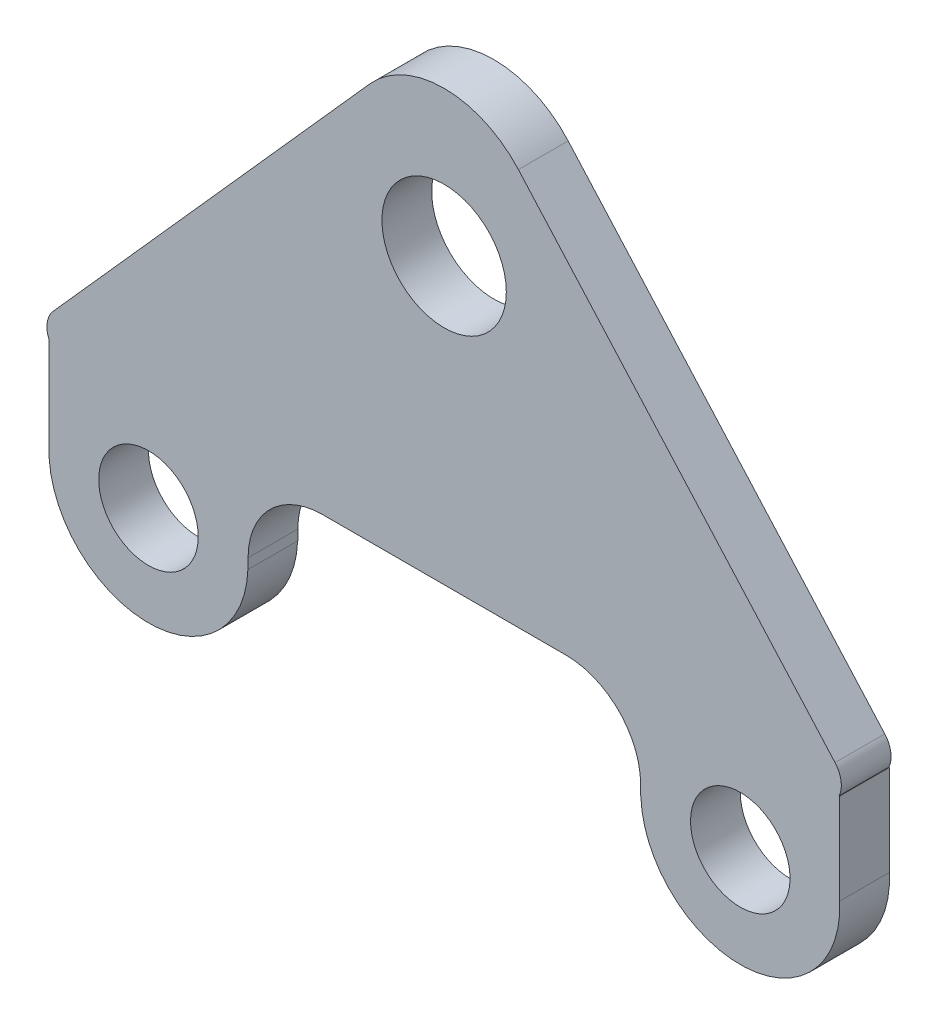
ISO-10303-21;
HEADER;
FILE_DESCRIPTION(('STEP AP214'),'2;1');
FILE_NAME('part.step','',(''),(''),'','','');
FILE_SCHEMA(('AUTOMOTIVE_DESIGN { 1 0 10303 214 1 1 1 1 }'));
ENDSEC;
DATA;
#1=APPLICATION_CONTEXT('core data for automotive mechanical design processes');
#2=APPLICATION_PROTOCOL_DEFINITION('international standard','automotive_design',2000,#1);
#3=PRODUCT_CONTEXT('',#1,'mechanical');
#4=PRODUCT('Part','Part','',(#3));
#5=PRODUCT_RELATED_PRODUCT_CATEGORY('part','',(#4));
#6=PRODUCT_DEFINITION_FORMATION('','',#4);
#7=PRODUCT_DEFINITION_CONTEXT('part definition',#1,'design');
#8=PRODUCT_DEFINITION('design','',#6,#7);
#9=PRODUCT_DEFINITION_SHAPE('','',#8);
#10=(LENGTH_UNIT() NAMED_UNIT(*) SI_UNIT(.MILLI.,.METRE.));
#11=(NAMED_UNIT(*) PLANE_ANGLE_UNIT() SI_UNIT($,.RADIAN.));
#12=(NAMED_UNIT(*) SI_UNIT($,.STERADIAN.) SOLID_ANGLE_UNIT());
#13=UNCERTAINTY_MEASURE_WITH_UNIT(LENGTH_MEASURE(1.E-05),#10,'distance_accuracy_value','');
#14=(GEOMETRIC_REPRESENTATION_CONTEXT(3) GLOBAL_UNCERTAINTY_ASSIGNED_CONTEXT((#13)) GLOBAL_UNIT_ASSIGNED_CONTEXT((#10,
#11,#12)) REPRESENTATION_CONTEXT('',''));
#15=CARTESIAN_POINT('',(0.,0.,0.));
#16=DIRECTION('',(0.,0.,1.));
#17=DIRECTION('',(1.,0.,0.));
#18=AXIS2_PLACEMENT_3D('',#15,#16,#17);
#19=CARTESIAN_POINT('',(41.481618266519,-6.81808244946121,4.));
#20=DIRECTION('',(1.,0.,0.));
#21=DIRECTION('',(0.,0.,-1.));
#22=AXIS2_PLACEMENT_3D('',#19,#20,#21);
#23=PLANE('',#22);
#24=DIRECTION('',(0.,-1.,0.));
#25=VECTOR('',#24,1.);
#26=CARTESIAN_POINT('',(41.481618266519,-6.81808244946121,4.));
#27=LINE('',#26,#25);
#28=CARTESIAN_POINT('',(41.481618266519,1.18191755053879,4.));
#29=VERTEX_POINT('',#28);
#30=CARTESIAN_POINT('',(41.481618266519,-6.13439152434948,4.));
#31=VERTEX_POINT('',#30);
#32=EDGE_CURVE('E190',#29,#31,#27,.T.);
#33=ORIENTED_EDGE('',*,*,#32,.T.);
#34=DIRECTION('',(0.,0.,1.));
#35=VECTOR('',#34,1.);
#36=CARTESIAN_POINT('',(41.481618266519,-6.13439152434948,0.));
#37=LINE('',#36,#35);
#38=CARTESIAN_POINT('',(41.481618266519,-6.13439152434948,0.));
#39=VERTEX_POINT('',#38);
#40=EDGE_CURVE('E178',#31,#39,#37,.F.);
#41=ORIENTED_EDGE('',*,*,#40,.T.);
#42=DIRECTION('',(0.,-1.,0.));
#43=VECTOR('',#42,1.);
#44=CARTESIAN_POINT('',(41.481618266519,-6.81808244946121,0.));
#45=LINE('',#44,#43);
#46=CARTESIAN_POINT('',(41.481618266519,1.18191755053879,0.));
#47=VERTEX_POINT('',#46);
#48=EDGE_CURVE('E189',#47,#39,#45,.T.);
#49=ORIENTED_EDGE('',*,*,#48,.F.);
#50=DIRECTION('',(0.,0.,-1.));
#51=VECTOR('',#50,1.);
#52=CARTESIAN_POINT('',(41.481618266519,1.18191755053879,4.));
#53=LINE('',#52,#51);
#54=EDGE_CURVE('E203',#29,#47,#53,.T.);
#55=ORIENTED_EDGE('',*,*,#54,.F.);
#56=EDGE_LOOP('',(#33,#41,#49,#55));
#57=FACE_BOUND('',#56,.T.);
#58=ADVANCED_FACE('F36',(#57),#23,.T.);
#59=CARTESIAN_POINT('',(25.481618266519,-6.81808244946121,4.));
#60=DIRECTION('',(0.,-1.,0.));
#61=DIRECTION('',(1.,0.,0.));
#62=AXIS2_PLACEMENT_3D('',#59,#60,#61);
#63=PLANE('',#62);
#64=DIRECTION('',(-1.,0.,0.));
#65=VECTOR('',#64,1.);
#66=CARTESIAN_POINT('',(25.481618266519,-6.81808244946121,0.));
#67=LINE('',#66,#65);
#68=CARTESIAN_POINT('',(25.4968850994738,-6.81808244946121,0.));
#69=VERTEX_POINT('',#68);
#70=CARTESIAN_POINT('',(25.481618266519,-6.81808244946121,0.));
#71=VERTEX_POINT('',#70);
#72=EDGE_CURVE('E169',#69,#71,#67,.T.);
#73=ORIENTED_EDGE('',*,*,#72,.F.);
#74=DIRECTION('',(0.,0.,1.));
#75=VECTOR('',#74,1.);
#76=CARTESIAN_POINT('',(25.4968850994738,-6.81808244946121,0.));
#77=LINE('',#76,#75);
#78=CARTESIAN_POINT('',(25.4968850994738,-6.81808244946121,4.));
#79=VERTEX_POINT('',#78);
#80=EDGE_CURVE('E167',#69,#79,#77,.T.);
#81=ORIENTED_EDGE('',*,*,#80,.T.);
#82=DIRECTION('',(-1.,0.,0.));
#83=VECTOR('',#82,1.);
#84=CARTESIAN_POINT('',(25.481618266519,-6.81808244946121,4.));
#85=LINE('',#84,#83);
#86=CARTESIAN_POINT('',(25.481618266519,-6.81808244946121,4.));
#87=VERTEX_POINT('',#86);
#88=EDGE_CURVE('E153',#79,#87,#85,.T.);
#89=ORIENTED_EDGE('',*,*,#88,.T.);
#90=DIRECTION('',(0.,0.,-1.));
#91=VECTOR('',#90,1.);
#92=CARTESIAN_POINT('',(25.481618266519,-6.81808244946121,4.));
#93=LINE('',#92,#91);
#94=EDGE_CURVE('E164',#87,#71,#93,.T.);
#95=ORIENTED_EDGE('',*,*,#94,.T.);
#96=EDGE_LOOP('',(#73,#81,#89,#95));
#97=FACE_BOUND('',#96,.T.);
#98=ADVANCED_FACE('F168',(#97),#63,.T.);
#99=CARTESIAN_POINT('',(-24.718317204901,0.,4.));
#100=DIRECTION('',(0.,1.,0.));
#101=DIRECTION('',(0.,0.,1.));
#102=AXIS2_PLACEMENT_3D('',#99,#100,#101);
#103=PLANE('',#102);
#104=DIRECTION('',(1.,0.,0.));
#105=VECTOR('',#104,1.);
#106=CARTESIAN_POINT('',(-24.718317204901,0.,0.));
#107=LINE('',#106,#105);
#108=CARTESIAN_POINT('',(-0.0816182665190172,0.,0.));
#109=VERTEX_POINT('',#108);
#110=CARTESIAN_POINT('',(19.481618266519,0.,0.));
#111=VERTEX_POINT('',#110);
#112=EDGE_CURVE('E259',#109,#111,#107,.T.);
#113=ORIENTED_EDGE('',*,*,#112,.T.);
#114=DIRECTION('',(0.,0.,1.));
#115=VECTOR('',#114,1.);
#116=CARTESIAN_POINT('',(19.481618266519,0.,4.));
#117=LINE('',#116,#115);
#118=CARTESIAN_POINT('',(19.481618266519,0.,4.));
#119=VERTEX_POINT('',#118);
#120=EDGE_CURVE('E173',#111,#119,#117,.T.);
#121=ORIENTED_EDGE('',*,*,#120,.T.);
#122=DIRECTION('',(1.,0.,0.));
#123=VECTOR('',#122,1.);
#124=CARTESIAN_POINT('',(-24.718317204901,0.,4.));
#125=LINE('',#124,#123);
#126=CARTESIAN_POINT('',(-0.0816182665190172,0.,4.));
#127=VERTEX_POINT('',#126);
#128=EDGE_CURVE('E251',#127,#119,#125,.T.);
#129=ORIENTED_EDGE('',*,*,#128,.F.);
#130=DIRECTION('',(0.,0.,1.));
#131=VECTOR('',#130,1.);
#132=CARTESIAN_POINT('',(-0.081618266519019,0.,0.));
#133=LINE('',#132,#131);
#134=EDGE_CURVE('E294',#127,#109,#133,.F.);
#135=ORIENTED_EDGE('',*,*,#134,.T.);
#136=EDGE_LOOP('',(#113,#121,#129,#135));
#137=FACE_BOUND('',#136,.T.);
#138=ADVANCED_FACE('F306',(#137),#103,.F.);
#139=CARTESIAN_POINT('',(-20.2565864569651,2.,4.));
#140=DIRECTION('',(0.,0.,-1.));
#141=DIRECTION('',(-1.,0.,0.));
#142=AXIS2_PLACEMENT_3D('',#139,#140,#141);
#143=CYLINDRICAL_SURFACE('',#142,2.);
#144=CARTESIAN_POINT('',(-20.2565864569651,2.,0.));
#145=DIRECTION('',(0.,0.,-1.));
#146=DIRECTION('',(-1.,0.,0.));
#147=AXIS2_PLACEMENT_3D('',#144,#145,#146);
#148=CIRCLE('',#147,2.);
#149=CARTESIAN_POINT('',(-22.081618266519,1.18191755053879,0.));
#150=VERTEX_POINT('',#149);
#151=CARTESIAN_POINT('',(-21.7496129500696,3.33074110588354,0.));
#152=VERTEX_POINT('',#151);
#153=EDGE_CURVE('E276',#150,#152,#148,.T.);
#154=ORIENTED_EDGE('',*,*,#153,.F.);
#155=DIRECTION('',(0.,0.,-1.));
#156=VECTOR('',#155,1.);
#157=CARTESIAN_POINT('',(-22.081618266519,1.18191755053879,4.));
#158=LINE('',#157,#156);
#159=CARTESIAN_POINT('',(-22.081618266519,1.18191755053879,4.));
#160=VERTEX_POINT('',#159);
#161=EDGE_CURVE('E229',#160,#150,#158,.T.);
#162=ORIENTED_EDGE('',*,*,#161,.F.);
#163=CARTESIAN_POINT('',(-20.2565864569651,2.,4.));
#164=DIRECTION('',(0.,0.,-1.));
#165=DIRECTION('',(-1.,0.,0.));
#166=AXIS2_PLACEMENT_3D('',#163,#164,#165);
#167=CIRCLE('',#166,2.);
#168=CARTESIAN_POINT('',(-21.7496129500696,3.33074110588354,4.));
#169=VERTEX_POINT('',#168);
#170=EDGE_CURVE('E282',#169,#160,#167,.F.);
#171=ORIENTED_EDGE('',*,*,#170,.F.);
#172=DIRECTION('',(0.,0.,-1.));
#173=VECTOR('',#172,1.);
#174=CARTESIAN_POINT('',(-21.7496129500696,3.33074110588354,4.));
#175=LINE('',#174,#173);
#176=EDGE_CURVE('E278',#152,#169,#175,.F.);
#177=ORIENTED_EDGE('',*,*,#176,.F.);
#178=EDGE_LOOP('',(#154,#162,#171,#177));
#179=FACE_BOUND('',#178,.T.);
#180=ADVANCED_FACE('F383',(#179),#143,.T.);
#181=CARTESIAN_POINT('',(-24.718317204901,0.,4.));
#182=DIRECTION('',(0.746513246552237,-0.665370552941771,0.));
#183=DIRECTION('',(0.665370552941771,0.746513246552237,0.));
#184=AXIS2_PLACEMENT_3D('',#181,#182,#183);
#185=PLANE('',#184);
#186=DIRECTION('',(-0.665370552941771,-0.746513246552237,0.));
#187=VECTOR('',#186,1.);
#188=CARTESIAN_POINT('',(-24.718317204901,0.,0.));
#189=LINE('',#188,#187);
#190=CARTESIAN_POINT('',(3.70861603588884,31.8936299920127,0.));
#191=VERTEX_POINT('',#190);
#192=EDGE_CURVE('E245',#191,#152,#189,.T.);
#193=ORIENTED_EDGE('',*,*,#192,.T.);
#194=ORIENTED_EDGE('',*,*,#176,.T.);
#195=DIRECTION('',(-0.665370552941771,-0.746513246552237,0.));
#196=VECTOR('',#195,1.);
#197=CARTESIAN_POINT('',(-24.718317204901,0.,4.));
#198=LINE('',#197,#196);
#199=CARTESIAN_POINT('',(3.70861603588884,31.8936299920127,4.));
#200=VERTEX_POINT('',#199);
#201=EDGE_CURVE('E248',#200,#169,#198,.T.);
#202=ORIENTED_EDGE('',*,*,#201,.F.);
#203=DIRECTION('',(0.,0.,-1.));
#204=VECTOR('',#203,1.);
#205=CARTESIAN_POINT('',(3.70861603588885,31.8936299920127,4.));
#206=LINE('',#205,#204);
#207=EDGE_CURVE('E256',#200,#191,#206,.T.);
#208=ORIENTED_EDGE('',*,*,#207,.T.);
#209=EDGE_LOOP('',(#193,#194,#202,#208));
#210=FACE_BOUND('',#209,.T.);
#211=ADVANCED_FACE('F379',(#210),#185,.F.);
#212=CARTESIAN_POINT('',(9.68072200830674,38.5940410614726,4.));
#213=DIRECTION('',(-0.746513246552237,-0.665370552941771,0.));
#214=DIRECTION('',(0.665370552941771,-0.746513246552237,0.));
#215=AXIS2_PLACEMENT_3D('',#212,#213,#214);
#216=PLANE('',#215);
#217=DIRECTION('',(-0.665370552941771,0.746513246552237,0.));
#218=VECTOR('',#217,1.);
#219=CARTESIAN_POINT('',(9.68072200830674,38.5940410614726,4.));
#220=LINE('',#219,#218);
#221=CARTESIAN_POINT('',(41.1110569666831,3.33074110588354,4.));
#222=VERTEX_POINT('',#221);
#223=CARTESIAN_POINT('',(15.6528279807246,31.8936299920127,4.));
#224=VERTEX_POINT('',#223);
#225=EDGE_CURVE('E254',#222,#224,#220,.T.);
#226=ORIENTED_EDGE('',*,*,#225,.F.);
#227=DIRECTION('',(0.,0.,-1.));
#228=VECTOR('',#227,1.);
#229=CARTESIAN_POINT('',(41.1110569666831,3.33074110588356,4.));
#230=LINE('',#229,#228);
#231=CARTESIAN_POINT('',(41.1110569666831,3.33074110588354,0.));
#232=VERTEX_POINT('',#231);
#233=EDGE_CURVE('E285',#222,#232,#230,.T.);
#234=ORIENTED_EDGE('',*,*,#233,.T.);
#235=DIRECTION('',(-0.665370552941771,0.746513246552237,0.));
#236=VECTOR('',#235,1.);
#237=CARTESIAN_POINT('',(9.68072200830674,38.5940410614726,0.));
#238=LINE('',#237,#236);
#239=CARTESIAN_POINT('',(15.6528279807246,31.8936299920127,0.));
#240=VERTEX_POINT('',#239);
#241=EDGE_CURVE('E252',#232,#240,#238,.T.);
#242=ORIENTED_EDGE('',*,*,#241,.T.);
#243=DIRECTION('',(0.,0.,-1.));
#244=VECTOR('',#243,1.);
#245=CARTESIAN_POINT('',(15.6528279807246,31.8936299920127,4.));
#246=LINE('',#245,#244);
#247=EDGE_CURVE('E268',#240,#224,#246,.F.);
#248=ORIENTED_EDGE('',*,*,#247,.T.);
#249=EDGE_LOOP('',(#226,#234,#242,#248));
#250=FACE_BOUND('',#249,.T.);
#251=ADVANCED_FACE('F371',(#250),#216,.F.);
#252=CARTESIAN_POINT('',(0.,0.,4.));
#253=DIRECTION('',(0.,0.,-1.));
#254=DIRECTION('',(-1.,0.,0.));
#255=AXIS2_PLACEMENT_3D('',#252,#253,#254);
#256=PLANE('',#255);
#257=CARTESIAN_POINT('',(33.4923385126825,-6.5484072425761,4.));
#258=DIRECTION('',(0.,0.,-1.));
#259=DIRECTION('',(-1.,0.,0.));
#260=AXIS2_PLACEMENT_3D('',#257,#258,#259);
#261=CIRCLE('',#260,4.);
#262=CARTESIAN_POINT('',(29.4923385126825,-6.5484072425761,4.));
#263=VERTEX_POINT('',#262);
#264=EDGE_CURVE('E184',#263,#263,#261,.T.);
#265=ORIENTED_EDGE('',*,*,#264,.T.);
#266=EDGE_LOOP('',(#265));
#267=FACE_BOUND('',#266,.T.);
#268=ORIENTED_EDGE('',*,*,#88,.F.);
#269=CARTESIAN_POINT('',(33.4923385126825,-6.5484072425761,4.));
#270=DIRECTION('',(0.,0.,-1.));
#271=DIRECTION('',(-1.,0.,0.));
#272=AXIS2_PLACEMENT_3D('',#269,#270,#271);
#273=CIRCLE('',#272,8.);
#274=EDGE_CURVE('E159',#31,#79,#273,.T.);
#275=ORIENTED_EDGE('',*,*,#274,.F.);
#276=ORIENTED_EDGE('',*,*,#32,.F.);
#277=DIRECTION('',(1.,0.,0.));
#278=VECTOR('',#277,1.);
#279=CARTESIAN_POINT('',(41.481618266519,1.18191755053879,4.));
#280=LINE('',#279,#278);
#281=CARTESIAN_POINT('',(41.4430622831325,1.18191755053879,4.));
#282=VERTEX_POINT('',#281);
#283=EDGE_CURVE('E192',#282,#29,#280,.T.);
#284=ORIENTED_EDGE('',*,*,#283,.F.);
#285=CARTESIAN_POINT('',(39.6180304735786,2.,4.));
#286=DIRECTION('',(0.,0.,-1.));
#287=DIRECTION('',(-1.,0.,0.));
#288=AXIS2_PLACEMENT_3D('',#285,#286,#287);
#289=CIRCLE('',#288,2.);
#290=EDGE_CURVE('E280',#282,#222,#289,.F.);
#291=ORIENTED_EDGE('',*,*,#290,.T.);
#292=ORIENTED_EDGE('',*,*,#225,.T.);
#293=CARTESIAN_POINT('',(9.68072200830674,26.5706655684785,4.));
#294=DIRECTION('',(0.,0.,-1.));
#295=DIRECTION('',(-1.,0.,0.));
#296=AXIS2_PLACEMENT_3D('',#293,#294,#295);
#297=CIRCLE('',#296,8.);
#298=EDGE_CURVE('E271',#224,#200,#297,.F.);
#299=ORIENTED_EDGE('',*,*,#298,.T.);
#300=ORIENTED_EDGE('',*,*,#201,.T.);
#301=ORIENTED_EDGE('',*,*,#170,.T.);
#302=DIRECTION('',(0.,-1.,0.));
#303=VECTOR('',#302,1.);
#304=CARTESIAN_POINT('',(-22.081618266519,-6.81808244946121,4.));
#305=LINE('',#304,#303);
#306=CARTESIAN_POINT('',(-22.081618266519,-6.13439152434961,4.));
#307=VERTEX_POINT('',#306);
#308=EDGE_CURVE('E220',#160,#307,#305,.T.);
#309=ORIENTED_EDGE('',*,*,#308,.T.);
#310=CARTESIAN_POINT('',(-14.0923385126825,-6.5484072425761,4.));
#311=DIRECTION('',(0.,0.,1.));
#312=DIRECTION('',(1.,0.,0.));
#313=AXIS2_PLACEMENT_3D('',#310,#311,#312);
#314=CIRCLE('',#313,8.);
#315=CARTESIAN_POINT('',(-6.09688509947379,-6.81808244946121,4.));
#316=VERTEX_POINT('',#315);
#317=EDGE_CURVE('E210',#307,#316,#314,.T.);
#318=ORIENTED_EDGE('',*,*,#317,.T.);
#319=DIRECTION('',(1.,0.,0.));
#320=VECTOR('',#319,1.);
#321=CARTESIAN_POINT('',(-6.08161826651902,-6.81808244946121,4.));
#322=LINE('',#321,#320);
#323=CARTESIAN_POINT('',(-6.08161826651902,-6.81808244946121,4.));
#324=VERTEX_POINT('',#323);
#325=EDGE_CURVE('E223',#316,#324,#322,.T.);
#326=ORIENTED_EDGE('',*,*,#325,.T.);
#327=DIRECTION('',(0.,1.,0.));
#328=VECTOR('',#327,1.);
#329=CARTESIAN_POINT('',(-6.08161826651902,1.18191755053879,4.));
#330=LINE('',#329,#328);
#331=CARTESIAN_POINT('',(-6.08161826651902,-6.,4.));
#332=VERTEX_POINT('',#331);
#333=EDGE_CURVE('E226',#324,#332,#330,.T.);
#334=ORIENTED_EDGE('',*,*,#333,.T.);
#335=CARTESIAN_POINT('',(-0.081618266519019,-6.,4.));
#336=DIRECTION('',(0.,0.,-1.));
#337=DIRECTION('',(-1.,0.,0.));
#338=AXIS2_PLACEMENT_3D('',#335,#336,#337);
#339=CIRCLE('',#338,6.);
#340=EDGE_CURVE('E296',#332,#127,#339,.T.);
#341=ORIENTED_EDGE('',*,*,#340,.T.);
#342=ORIENTED_EDGE('',*,*,#128,.T.);
#343=CARTESIAN_POINT('',(19.481618266519,-6.,4.));
#344=DIRECTION('',(0.,0.,-1.));
#345=DIRECTION('',(-1.,0.,0.));
#346=AXIS2_PLACEMENT_3D('',#343,#344,#345);
#347=CIRCLE('',#346,6.);
#348=CARTESIAN_POINT('',(25.481618266519,-6.,4.));
#349=VERTEX_POINT('',#348);
#350=EDGE_CURVE('E44',#119,#349,#347,.T.);
#351=ORIENTED_EDGE('',*,*,#350,.T.);
#352=DIRECTION('',(0.,1.,0.));
#353=VECTOR('',#352,1.);
#354=CARTESIAN_POINT('',(25.481618266519,1.18191755053879,4.));
#355=LINE('',#354,#353);
#356=EDGE_CURVE('E160',#87,#349,#355,.T.);
#357=ORIENTED_EDGE('',*,*,#356,.F.);
#358=EDGE_LOOP('',(#268,#275,#276,#284,#291,#292,#299,#300,#301,#309,#318,#326,#334,#341,#342,
#351,#357));
#359=FACE_BOUND('',#358,.T.);
#360=CARTESIAN_POINT('',(-14.0923385126825,-6.5484072425761,4.));
#361=DIRECTION('',(0.,0.,1.));
#362=DIRECTION('',(1.,0.,0.));
#363=AXIS2_PLACEMENT_3D('',#360,#361,#362);
#364=CIRCLE('',#363,4.);
#365=CARTESIAN_POINT('',(-10.0923385126825,-6.5484072425761,4.));
#366=VERTEX_POINT('',#365);
#367=EDGE_CURVE('E206',#366,#366,#364,.T.);
#368=ORIENTED_EDGE('',*,*,#367,.F.);
#369=EDGE_LOOP('',(#368));
#370=FACE_BOUND('',#369,.T.);
#371=CARTESIAN_POINT('',(9.68072200830674,22.887439188464,4.));
#372=DIRECTION('',(0.,0.,1.));
#373=DIRECTION('',(1.,0.,0.));
#374=AXIS2_PLACEMENT_3D('',#371,#372,#373);
#375=CIRCLE('',#374,5.);
#376=CARTESIAN_POINT('',(14.6807220083067,22.887439188464,4.));
#377=VERTEX_POINT('',#376);
#378=EDGE_CURVE('E241',#377,#377,#375,.T.);
#379=ORIENTED_EDGE('',*,*,#378,.F.);
#380=EDGE_LOOP('',(#379));
#381=FACE_BOUND('',#380,.T.);
#382=ADVANCED_FACE('F155',(#267,#359,#370,#381),#256,.F.);
#383=CARTESIAN_POINT('',(0.,0.,0.));
#384=DIRECTION('',(0.,0.,-1.));
#385=DIRECTION('',(-1.,0.,0.));
#386=AXIS2_PLACEMENT_3D('',#383,#384,#385);
#387=PLANE('',#386);
#388=CARTESIAN_POINT('',(33.4923385126825,-6.5484072425761,0.));
#389=DIRECTION('',(0.,0.,-1.));
#390=DIRECTION('',(-1.,0.,0.));
#391=AXIS2_PLACEMENT_3D('',#388,#389,#390);
#392=CIRCLE('',#391,4.);
#393=CARTESIAN_POINT('',(29.4923385126825,-6.5484072425761,0.));
#394=VERTEX_POINT('',#393);
#395=EDGE_CURVE('E180',#394,#394,#392,.T.);
#396=ORIENTED_EDGE('',*,*,#395,.F.);
#397=EDGE_LOOP('',(#396));
#398=FACE_BOUND('',#397,.T.);
#399=ORIENTED_EDGE('',*,*,#48,.T.);
#400=CARTESIAN_POINT('',(33.4923385126825,-6.5484072425761,0.));
#401=DIRECTION('',(0.,0.,-1.));
#402=DIRECTION('',(-1.,0.,0.));
#403=AXIS2_PLACEMENT_3D('',#400,#401,#402);
#404=CIRCLE('',#403,8.);
#405=EDGE_CURVE('E179',#39,#69,#404,.T.);
#406=ORIENTED_EDGE('',*,*,#405,.T.);
#407=ORIENTED_EDGE('',*,*,#72,.T.);
#408=DIRECTION('',(0.,1.,0.));
#409=VECTOR('',#408,1.);
#410=CARTESIAN_POINT('',(25.481618266519,1.18191755053879,0.));
#411=LINE('',#410,#409);
#412=CARTESIAN_POINT('',(25.481618266519,-6.,0.));
#413=VERTEX_POINT('',#412);
#414=EDGE_CURVE('E199',#71,#413,#411,.T.);
#415=ORIENTED_EDGE('',*,*,#414,.T.);
#416=CARTESIAN_POINT('',(19.481618266519,-6.,0.));
#417=DIRECTION('',(0.,0.,-1.));
#418=DIRECTION('',(-1.,0.,0.));
#419=AXIS2_PLACEMENT_3D('',#416,#417,#418);
#420=CIRCLE('',#419,6.);
#421=EDGE_CURVE('E11',#413,#111,#420,.F.);
#422=ORIENTED_EDGE('',*,*,#421,.T.);
#423=ORIENTED_EDGE('',*,*,#112,.F.);
#424=CARTESIAN_POINT('',(-0.081618266519019,-6.,0.));
#425=DIRECTION('',(0.,0.,-1.));
#426=DIRECTION('',(-1.,0.,0.));
#427=AXIS2_PLACEMENT_3D('',#424,#425,#426);
#428=CIRCLE('',#427,6.);
#429=CARTESIAN_POINT('',(-6.08161826651902,-6.,0.));
#430=VERTEX_POINT('',#429);
#431=EDGE_CURVE('E298',#109,#430,#428,.F.);
#432=ORIENTED_EDGE('',*,*,#431,.T.);
#433=DIRECTION('',(0.,1.,0.));
#434=VECTOR('',#433,1.);
#435=CARTESIAN_POINT('',(-6.08161826651902,1.18191755053879,0.));
#436=LINE('',#435,#434);
#437=CARTESIAN_POINT('',(-6.08161826651902,-6.81808244946121,0.));
#438=VERTEX_POINT('',#437);
#439=EDGE_CURVE('E224',#438,#430,#436,.T.);
#440=ORIENTED_EDGE('',*,*,#439,.F.);
#441=DIRECTION('',(1.,0.,0.));
#442=VECTOR('',#441,1.);
#443=CARTESIAN_POINT('',(-6.08161826651902,-6.81808244946121,0.));
#444=LINE('',#443,#442);
#445=CARTESIAN_POINT('',(-6.09688509947379,-6.81808244946121,0.));
#446=VERTEX_POINT('',#445);
#447=EDGE_CURVE('E232',#446,#438,#444,.T.);
#448=ORIENTED_EDGE('',*,*,#447,.F.);
#449=CARTESIAN_POINT('',(-14.0923385126825,-6.5484072425761,0.));
#450=DIRECTION('',(0.,0.,1.));
#451=DIRECTION('',(1.,0.,0.));
#452=AXIS2_PLACEMENT_3D('',#449,#450,#451);
#453=CIRCLE('',#452,8.);
#454=CARTESIAN_POINT('',(-22.081618266519,-6.13439152434961,0.));
#455=VERTEX_POINT('',#454);
#456=EDGE_CURVE('E213',#455,#446,#453,.T.);
#457=ORIENTED_EDGE('',*,*,#456,.F.);
#458=DIRECTION('',(0.,-1.,0.));
#459=VECTOR('',#458,1.);
#460=CARTESIAN_POINT('',(-22.081618266519,-6.81808244946121,0.));
#461=LINE('',#460,#459);
#462=EDGE_CURVE('E219',#150,#455,#461,.T.);
#463=ORIENTED_EDGE('',*,*,#462,.F.);
#464=ORIENTED_EDGE('',*,*,#153,.T.);
#465=ORIENTED_EDGE('',*,*,#192,.F.);
#466=CARTESIAN_POINT('',(9.68072200830674,26.5706655684785,0.));
#467=DIRECTION('',(0.,0.,-1.));
#468=DIRECTION('',(-1.,0.,0.));
#469=AXIS2_PLACEMENT_3D('',#466,#467,#468);
#470=CIRCLE('',#469,8.);
#471=EDGE_CURVE('E265',#191,#240,#470,.T.);
#472=ORIENTED_EDGE('',*,*,#471,.T.);
#473=ORIENTED_EDGE('',*,*,#241,.F.);
#474=CARTESIAN_POINT('',(39.6180304735786,2.,0.));
#475=DIRECTION('',(0.,0.,-1.));
#476=DIRECTION('',(-1.,0.,0.));
#477=AXIS2_PLACEMENT_3D('',#474,#475,#476);
#478=CIRCLE('',#477,2.);
#479=CARTESIAN_POINT('',(41.4430622831325,1.18191755053879,0.));
#480=VERTEX_POINT('',#479);
#481=EDGE_CURVE('E273',#232,#480,#478,.T.);
#482=ORIENTED_EDGE('',*,*,#481,.T.);
#483=DIRECTION('',(1.,0.,0.));
#484=VECTOR('',#483,1.);
#485=CARTESIAN_POINT('',(41.481618266519,1.18191755053879,0.));
#486=LINE('',#485,#484);
#487=EDGE_CURVE('E197',#480,#47,#486,.T.);
#488=ORIENTED_EDGE('',*,*,#487,.T.);
#489=EDGE_LOOP('',(#399,#406,#407,#415,#422,#423,#432,#440,#448,#457,#463,#464,#465,#472,#473,
#482,#488));
#490=FACE_BOUND('',#489,.T.);
#491=CARTESIAN_POINT('',(-14.0923385126825,-6.5484072425761,0.));
#492=DIRECTION('',(0.,0.,1.));
#493=DIRECTION('',(1.,0.,0.));
#494=AXIS2_PLACEMENT_3D('',#491,#492,#493);
#495=CIRCLE('',#494,4.);
#496=CARTESIAN_POINT('',(-10.0923385126825,-6.5484072425761,0.));
#497=VERTEX_POINT('',#496);
#498=EDGE_CURVE('E207',#497,#497,#495,.T.);
#499=ORIENTED_EDGE('',*,*,#498,.T.);
#500=EDGE_LOOP('',(#499));
#501=FACE_BOUND('',#500,.T.);
#502=CARTESIAN_POINT('',(9.68072200830674,22.887439188464,0.));
#503=DIRECTION('',(0.,0.,1.));
#504=DIRECTION('',(1.,0.,0.));
#505=AXIS2_PLACEMENT_3D('',#502,#503,#504);
#506=CIRCLE('',#505,5.);
#507=CARTESIAN_POINT('',(14.6807220083067,22.887439188464,0.));
#508=VERTEX_POINT('',#507);
#509=EDGE_CURVE('E242',#508,#508,#506,.T.);
#510=ORIENTED_EDGE('',*,*,#509,.T.);
#511=EDGE_LOOP('',(#510));
#512=FACE_BOUND('',#511,.T.);
#513=ADVANCED_FACE('F322',(#398,#490,#501,#512),#387,.T.);
#514=CARTESIAN_POINT('',(9.68072200830674,26.5706655684785,4.));
#515=DIRECTION('',(0.,0.,-1.));
#516=DIRECTION('',(-1.,0.,0.));
#517=AXIS2_PLACEMENT_3D('',#514,#515,#516);
#518=CYLINDRICAL_SURFACE('',#517,8.);
#519=ORIENTED_EDGE('',*,*,#298,.F.);
#520=ORIENTED_EDGE('',*,*,#247,.F.);
#521=ORIENTED_EDGE('',*,*,#471,.F.);
#522=ORIENTED_EDGE('',*,*,#207,.F.);
#523=EDGE_LOOP('',(#519,#520,#521,#522));
#524=FACE_BOUND('',#523,.T.);
#525=ADVANCED_FACE('F375',(#524),#518,.T.);
#526=CARTESIAN_POINT('',(39.6180304735786,2.,4.));
#527=DIRECTION('',(0.,0.,-1.));
#528=DIRECTION('',(-1.,0.,0.));
#529=AXIS2_PLACEMENT_3D('',#526,#527,#528);
#530=CYLINDRICAL_SURFACE('',#529,2.);
#531=DIRECTION('',(0.,0.,-1.));
#532=VECTOR('',#531,1.);
#533=CARTESIAN_POINT('',(41.4430622831325,1.18191755053879,4.));
#534=LINE('',#533,#532);
#535=EDGE_CURVE('E174',#480,#282,#534,.F.);
#536=ORIENTED_EDGE('',*,*,#535,.F.);
#537=ORIENTED_EDGE('',*,*,#481,.F.);
#538=ORIENTED_EDGE('',*,*,#233,.F.);
#539=ORIENTED_EDGE('',*,*,#290,.F.);
#540=EDGE_LOOP('',(#536,#537,#538,#539));
#541=FACE_BOUND('',#540,.T.);
#542=ADVANCED_FACE('F367',(#541),#530,.T.);
#543=CARTESIAN_POINT('',(9.68072200830674,22.887439188464,0.));
#544=DIRECTION('',(0.,0.,1.));
#545=DIRECTION('',(1.,0.,0.));
#546=AXIS2_PLACEMENT_3D('',#543,#544,#545);
#547=CYLINDRICAL_SURFACE('',#546,5.);
#548=ORIENTED_EDGE('',*,*,#509,.F.);
#549=EDGE_LOOP('',(#548));
#550=FACE_BOUND('',#549,.T.);
#551=ORIENTED_EDGE('',*,*,#378,.T.);
#552=EDGE_LOOP('',(#551));
#553=FACE_BOUND('',#552,.T.);
#554=ADVANCED_FACE('F358',(#550,#553),#547,.F.);
#555=CARTESIAN_POINT('',(-6.08161826651902,1.18191755053879,4.));
#556=DIRECTION('',(-1.,0.,0.));
#557=DIRECTION('',(0.,0.,1.));
#558=AXIS2_PLACEMENT_3D('',#555,#556,#557);
#559=PLANE('',#558);
#560=ORIENTED_EDGE('',*,*,#439,.T.);
#561=DIRECTION('',(0.,0.,1.));
#562=VECTOR('',#561,1.);
#563=CARTESIAN_POINT('',(-6.08161826651902,-6.,4.));
#564=LINE('',#563,#562);
#565=EDGE_CURVE('E291',#430,#332,#564,.T.);
#566=ORIENTED_EDGE('',*,*,#565,.T.);
#567=ORIENTED_EDGE('',*,*,#333,.F.);
#568=DIRECTION('',(0.,0.,-1.));
#569=VECTOR('',#568,1.);
#570=CARTESIAN_POINT('',(-6.08161826651902,-6.81808244946121,4.));
#571=LINE('',#570,#569);
#572=EDGE_CURVE('E238',#324,#438,#571,.T.);
#573=ORIENTED_EDGE('',*,*,#572,.T.);
#574=EDGE_LOOP('',(#560,#566,#567,#573));
#575=FACE_BOUND('',#574,.T.);
#576=ADVANCED_FACE('F317',(#575),#559,.F.);
#577=CARTESIAN_POINT('',(-22.081618266519,-6.81808244946121,4.));
#578=DIRECTION('',(1.,0.,0.));
#579=DIRECTION('',(0.,0.,-1.));
#580=AXIS2_PLACEMENT_3D('',#577,#578,#579);
#581=PLANE('',#580);
#582=ORIENTED_EDGE('',*,*,#462,.T.);
#583=DIRECTION('',(0.,0.,1.));
#584=VECTOR('',#583,1.);
#585=CARTESIAN_POINT('',(-22.081618266519,-6.13439152434961,0.));
#586=LINE('',#585,#584);
#587=EDGE_CURVE('E215',#455,#307,#586,.T.);
#588=ORIENTED_EDGE('',*,*,#587,.T.);
#589=ORIENTED_EDGE('',*,*,#308,.F.);
#590=ORIENTED_EDGE('',*,*,#161,.T.);
#591=EDGE_LOOP('',(#582,#588,#589,#590));
#592=FACE_BOUND('',#591,.T.);
#593=ADVANCED_FACE('F357',(#592),#581,.F.);
#594=CARTESIAN_POINT('',(-6.08161826651902,-6.81808244946121,4.));
#595=DIRECTION('',(0.,1.,0.));
#596=DIRECTION('',(-1.,0.,0.));
#597=AXIS2_PLACEMENT_3D('',#594,#595,#596);
#598=PLANE('',#597);
#599=ORIENTED_EDGE('',*,*,#325,.F.);
#600=DIRECTION('',(0.,0.,1.));
#601=VECTOR('',#600,1.);
#602=CARTESIAN_POINT('',(-6.09688509947379,-6.81808244946121,0.));
#603=LINE('',#602,#601);
#604=EDGE_CURVE('E288',#316,#446,#603,.F.);
#605=ORIENTED_EDGE('',*,*,#604,.T.);
#606=ORIENTED_EDGE('',*,*,#447,.T.);
#607=ORIENTED_EDGE('',*,*,#572,.F.);
#608=EDGE_LOOP('',(#599,#605,#606,#607));
#609=FACE_BOUND('',#608,.T.);
#610=ADVANCED_FACE('F353',(#609),#598,.F.);
#611=CARTESIAN_POINT('',(-14.0923385126825,-6.5484072425761,0.));
#612=DIRECTION('',(0.,0.,1.));
#613=DIRECTION('',(1.,0.,0.));
#614=AXIS2_PLACEMENT_3D('',#611,#612,#613);
#615=CYLINDRICAL_SURFACE('',#614,8.);
#616=ORIENTED_EDGE('',*,*,#587,.F.);
#617=ORIENTED_EDGE('',*,*,#456,.T.);
#618=ORIENTED_EDGE('',*,*,#604,.F.);
#619=ORIENTED_EDGE('',*,*,#317,.F.);
#620=EDGE_LOOP('',(#616,#617,#618,#619));
#621=FACE_BOUND('',#620,.T.);
#622=ADVANCED_FACE('F350',(#621),#615,.T.);
#623=CARTESIAN_POINT('',(-0.081618266519019,-6.,4.));
#624=DIRECTION('',(0.,0.,-1.));
#625=DIRECTION('',(-1.,0.,0.));
#626=AXIS2_PLACEMENT_3D('',#623,#624,#625);
#627=CYLINDRICAL_SURFACE('',#626,6.);
#628=ORIENTED_EDGE('',*,*,#431,.F.);
#629=ORIENTED_EDGE('',*,*,#134,.F.);
#630=ORIENTED_EDGE('',*,*,#340,.F.);
#631=ORIENTED_EDGE('',*,*,#565,.F.);
#632=EDGE_LOOP('',(#628,#629,#630,#631));
#633=FACE_BOUND('',#632,.T.);
#634=ADVANCED_FACE('F315',(#633),#627,.F.);
#635=CARTESIAN_POINT('',(-14.0923385126825,-6.5484072425761,0.));
#636=DIRECTION('',(0.,0.,1.));
#637=DIRECTION('',(1.,0.,0.));
#638=AXIS2_PLACEMENT_3D('',#635,#636,#637);
#639=CYLINDRICAL_SURFACE('',#638,4.);
#640=ORIENTED_EDGE('',*,*,#498,.F.);
#641=EDGE_LOOP('',(#640));
#642=FACE_BOUND('',#641,.T.);
#643=ORIENTED_EDGE('',*,*,#367,.T.);
#644=EDGE_LOOP('',(#643));
#645=FACE_BOUND('',#644,.T.);
#646=ADVANCED_FACE('F345',(#642,#645),#639,.F.);
#647=CARTESIAN_POINT('',(25.481618266519,1.18191755053879,4.));
#648=DIRECTION('',(-1.,0.,0.));
#649=DIRECTION('',(0.,0.,1.));
#650=AXIS2_PLACEMENT_3D('',#647,#648,#649);
#651=PLANE('',#650);
#652=ORIENTED_EDGE('',*,*,#356,.T.);
#653=DIRECTION('',(0.,0.,1.));
#654=VECTOR('',#653,1.);
#655=CARTESIAN_POINT('',(25.481618266519,-6.,4.));
#656=LINE('',#655,#654);
#657=EDGE_CURVE('E57',#349,#413,#656,.F.);
#658=ORIENTED_EDGE('',*,*,#657,.T.);
#659=ORIENTED_EDGE('',*,*,#414,.F.);
#660=ORIENTED_EDGE('',*,*,#94,.F.);
#661=EDGE_LOOP('',(#652,#658,#659,#660));
#662=FACE_BOUND('',#661,.T.);
#663=ADVANCED_FACE('F348',(#662),#651,.T.);
#664=CARTESIAN_POINT('',(41.481618266519,1.18191755053879,4.));
#665=DIRECTION('',(0.,1.,0.));
#666=DIRECTION('',(0.,0.,1.));
#667=AXIS2_PLACEMENT_3D('',#664,#665,#666);
#668=PLANE('',#667);
#669=ORIENTED_EDGE('',*,*,#487,.F.);
#670=ORIENTED_EDGE('',*,*,#535,.T.);
#671=ORIENTED_EDGE('',*,*,#283,.T.);
#672=ORIENTED_EDGE('',*,*,#54,.T.);
#673=EDGE_LOOP('',(#669,#670,#671,#672));
#674=FACE_BOUND('',#673,.T.);
#675=ADVANCED_FACE('F333',(#674),#668,.T.);
#676=CARTESIAN_POINT('',(33.4923385126825,-6.5484072425761,0.));
#677=DIRECTION('',(0.,0.,1.));
#678=DIRECTION('',(1.,0.,0.));
#679=AXIS2_PLACEMENT_3D('',#676,#677,#678);
#680=CYLINDRICAL_SURFACE('',#679,8.);
#681=ORIENTED_EDGE('',*,*,#40,.F.);
#682=ORIENTED_EDGE('',*,*,#274,.T.);
#683=ORIENTED_EDGE('',*,*,#80,.F.);
#684=ORIENTED_EDGE('',*,*,#405,.F.);
#685=EDGE_LOOP('',(#681,#682,#683,#684));
#686=FACE_BOUND('',#685,.T.);
#687=ADVANCED_FACE('F177',(#686),#680,.T.);
#688=CARTESIAN_POINT('',(19.481618266519,-6.,4.));
#689=DIRECTION('',(0.,0.,1.));
#690=DIRECTION('',(1.,0.,0.));
#691=AXIS2_PLACEMENT_3D('',#688,#689,#690);
#692=CYLINDRICAL_SURFACE('',#691,6.);
#693=ORIENTED_EDGE('',*,*,#421,.F.);
#694=ORIENTED_EDGE('',*,*,#657,.F.);
#695=ORIENTED_EDGE('',*,*,#350,.F.);
#696=ORIENTED_EDGE('',*,*,#120,.F.);
#697=EDGE_LOOP('',(#693,#694,#695,#696));
#698=FACE_BOUND('',#697,.T.);
#699=ADVANCED_FACE('F38',(#698),#692,.F.);
#700=CARTESIAN_POINT('',(33.4923385126825,-6.5484072425761,0.));
#701=DIRECTION('',(0.,0.,1.));
#702=DIRECTION('',(1.,0.,0.));
#703=AXIS2_PLACEMENT_3D('',#700,#701,#702);
#704=CYLINDRICAL_SURFACE('',#703,4.);
#705=ORIENTED_EDGE('',*,*,#395,.T.);
#706=EDGE_LOOP('',(#705));
#707=FACE_BOUND('',#706,.T.);
#708=ORIENTED_EDGE('',*,*,#264,.F.);
#709=EDGE_LOOP('',(#708));
#710=FACE_BOUND('',#709,.T.);
#711=ADVANCED_FACE('F326',(#707,#710),#704,.F.);
#712=CLOSED_SHELL('',(#58,#98,#138,#180,#211,#251,#382,#513,#525,#542,#554,#576,#593,#610,#622,
#634,#646,#663,#675,#687,#699,#711));
#713=MANIFOLD_SOLID_BREP('B2',#712);
#714=ADVANCED_BREP_SHAPE_REPRESENTATION('',(#18,#713),#14);
#715=SHAPE_DEFINITION_REPRESENTATION(#9,#714);
ENDSEC;
END-ISO-10303-21;
